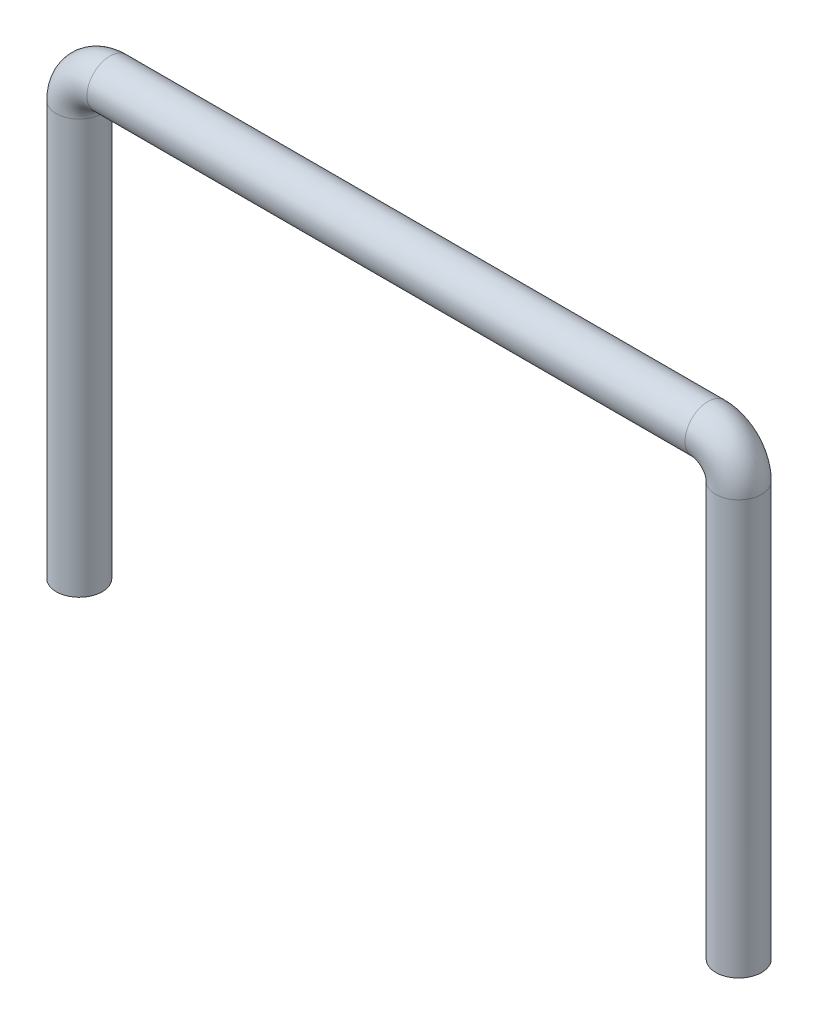
ISO-10303-21;
HEADER;
FILE_DESCRIPTION(('STEP AP214'),'2;1');
FILE_NAME('part.step','',(''),(''),'','','');
FILE_SCHEMA(('AUTOMOTIVE_DESIGN { 1 0 10303 214 1 1 1 1 }'));
ENDSEC;
DATA;
#1=APPLICATION_CONTEXT('core data for automotive mechanical design processes');
#2=APPLICATION_PROTOCOL_DEFINITION('international standard','automotive_design',2000,#1);
#3=PRODUCT_CONTEXT('',#1,'mechanical');
#4=PRODUCT('Part','Part','',(#3));
#5=PRODUCT_RELATED_PRODUCT_CATEGORY('part','',(#4));
#6=PRODUCT_DEFINITION_FORMATION('','',#4);
#7=PRODUCT_DEFINITION_CONTEXT('part definition',#1,'design');
#8=PRODUCT_DEFINITION('design','',#6,#7);
#9=PRODUCT_DEFINITION_SHAPE('','',#8);
#10=(LENGTH_UNIT() NAMED_UNIT(*) SI_UNIT(.MILLI.,.METRE.));
#11=(NAMED_UNIT(*) PLANE_ANGLE_UNIT() SI_UNIT($,.RADIAN.));
#12=(NAMED_UNIT(*) SI_UNIT($,.STERADIAN.) SOLID_ANGLE_UNIT());
#13=UNCERTAINTY_MEASURE_WITH_UNIT(LENGTH_MEASURE(1.E-05),#10,'distance_accuracy_value','');
#14=(GEOMETRIC_REPRESENTATION_CONTEXT(3) GLOBAL_UNCERTAINTY_ASSIGNED_CONTEXT((#13)) GLOBAL_UNIT_ASSIGNED_CONTEXT((#10,
#11,#12)) REPRESENTATION_CONTEXT('',''));
#15=CARTESIAN_POINT('',(0.,0.,0.));
#16=DIRECTION('',(0.,0.,1.));
#17=DIRECTION('',(1.,0.,0.));
#18=AXIS2_PLACEMENT_3D('',#15,#16,#17);
#19=CARTESIAN_POINT('',(-130.416139423431,0.,0.));
#20=DIRECTION('',(0.,1.,0.));
#21=DIRECTION('',(0.,0.,1.));
#22=AXIS2_PLACEMENT_3D('',#19,#20,#21);
#23=PLANE('',#22);
#24=CARTESIAN_POINT('',(-130.416139423431,0.,0.));
#25=DIRECTION('',(0.,1.,0.));
#26=DIRECTION('',(0.,0.,1.));
#27=AXIS2_PLACEMENT_3D('',#24,#25,#26);
#28=CIRCLE('',#27,7.50000000000001);
#29=CARTESIAN_POINT('',(-130.416139423431,0.,7.50000000000001));
#30=VERTEX_POINT('',#29);
#31=EDGE_CURVE('E61',#30,#30,#28,.T.);
#32=ORIENTED_EDGE('',*,*,#31,.F.);
#33=EDGE_LOOP('',(#32));
#34=FACE_BOUND('',#33,.T.);
#35=ADVANCED_FACE('F39',(#34),#23,.F.);
#36=CARTESIAN_POINT('',(84.5838605765687,0.,0.));
#37=DIRECTION('',(0.,-1.,0.));
#38=DIRECTION('',(0.,0.,1.));
#39=AXIS2_PLACEMENT_3D('',#36,#37,#38);
#40=PLANE('',#39);
#41=CARTESIAN_POINT('',(84.5838605765687,0.,0.));
#42=DIRECTION('',(0.,-1.,0.));
#43=DIRECTION('',(0.,0.,1.));
#44=AXIS2_PLACEMENT_3D('',#41,#42,#43);
#45=CIRCLE('',#44,7.50000000000001);
#46=CARTESIAN_POINT('',(84.5838605765687,0.,7.50000000000001));
#47=VERTEX_POINT('',#46);
#48=EDGE_CURVE('E10',#47,#47,#45,.T.);
#49=ORIENTED_EDGE('',*,*,#48,.T.);
#50=EDGE_LOOP('',(#49));
#51=FACE_BOUND('',#50,.T.);
#52=ADVANCED_FACE('F68',(#51),#40,.T.);
#53=CARTESIAN_POINT('',(-130.416139423431,0.,0.));
#54=DIRECTION('',(0.,1.,0.));
#55=DIRECTION('',(0.,0.,1.));
#56=AXIS2_PLACEMENT_3D('',#53,#54,#55);
#57=CYLINDRICAL_SURFACE('',#56,7.50000000000001);
#58=CARTESIAN_POINT('',(-130.416139423431,135.,0.));
#59=DIRECTION('',(0.,1.,0.));
#60=DIRECTION('',(0.,0.,1.));
#61=AXIS2_PLACEMENT_3D('',#58,#59,#60);
#62=CIRCLE('',#61,7.50000000000001);
#63=CARTESIAN_POINT('',(-137.916139423431,135.,0.));
#64=VERTEX_POINT('',#63);
#65=EDGE_CURVE('E58',#64,#64,#62,.T.);
#66=ORIENTED_EDGE('',*,*,#65,.F.);
#67=EDGE_LOOP('',(#66));
#68=FACE_BOUND('',#67,.T.);
#69=ORIENTED_EDGE('',*,*,#31,.T.);
#70=EDGE_LOOP('',(#69));
#71=FACE_BOUND('',#70,.T.);
#72=ADVANCED_FACE('F65',(#68,#71),#57,.T.);
#73=CARTESIAN_POINT('',(-120.416139423431,135.,0.));
#74=DIRECTION('',(0.,0.,-1.));
#75=DIRECTION('',(-1.,0.,0.));
#76=AXIS2_PLACEMENT_3D('',#73,#74,#75);
#77=TOROIDAL_SURFACE('',#76,9.99999999999999,7.50000000000001);
#78=CARTESIAN_POINT('',(-120.416139423431,145.,0.));
#79=DIRECTION('',(1.,0.,0.));
#80=DIRECTION('',(0.,0.,1.));
#81=AXIS2_PLACEMENT_3D('',#78,#79,#80);
#82=CIRCLE('',#81,7.50000000000001);
#83=CARTESIAN_POINT('',(-120.416139423431,152.5,0.));
#84=VERTEX_POINT('',#83);
#85=EDGE_CURVE('E53',#84,#84,#82,.T.);
#86=CARTESIAN_POINT('',(-120.416139423431,135.,0.));
#87=DIRECTION('',(0.,0.,-1.));
#88=DIRECTION('',(-1.,0.,0.));
#89=AXIS2_PLACEMENT_3D('',#86,#87,#88);
#90=CIRCLE('',#89,17.5);
#91=EDGE_CURVE('',#64,#84,#90,.T.);
#92=ORIENTED_EDGE('',*,*,#65,.T.);
#93=ORIENTED_EDGE('',*,*,#85,.F.);
#94=ORIENTED_EDGE('',*,*,#91,.T.);
#95=ORIENTED_EDGE('',*,*,#91,.F.);
#96=EDGE_LOOP('',(#92,#94,#93,#95));
#97=FACE_BOUND('',#96,.T.);
#98=ADVANCED_FACE('F86',(#97),#77,.T.);
#99=CARTESIAN_POINT('',(-120.416139423431,145.,0.));
#100=DIRECTION('',(1.,0.,0.));
#101=DIRECTION('',(0.,0.,-1.));
#102=AXIS2_PLACEMENT_3D('',#99,#100,#101);
#103=CYLINDRICAL_SURFACE('',#102,7.50000000000001);
#104=CARTESIAN_POINT('',(74.5838605765687,145.,0.));
#105=DIRECTION('',(1.,0.,0.));
#106=DIRECTION('',(0.,0.,1.));
#107=AXIS2_PLACEMENT_3D('',#104,#105,#106);
#108=CIRCLE('',#107,7.50000000000001);
#109=CARTESIAN_POINT('',(74.5838605765686,152.5,0.));
#110=VERTEX_POINT('',#109);
#111=EDGE_CURVE('E49',#110,#110,#108,.T.);
#112=ORIENTED_EDGE('',*,*,#111,.F.);
#113=EDGE_LOOP('',(#112));
#114=FACE_BOUND('',#113,.T.);
#115=ORIENTED_EDGE('',*,*,#85,.T.);
#116=EDGE_LOOP('',(#115));
#117=FACE_BOUND('',#116,.T.);
#118=ADVANCED_FACE('F80',(#114,#117),#103,.T.);
#119=CARTESIAN_POINT('',(74.5838605765687,135.,0.));
#120=DIRECTION('',(0.,0.,-1.));
#121=DIRECTION('',(-1.,0.,0.));
#122=AXIS2_PLACEMENT_3D('',#119,#120,#121);
#123=TOROIDAL_SURFACE('',#122,10.,7.50000000000001);
#124=CARTESIAN_POINT('',(84.5838605765687,135.,0.));
#125=DIRECTION('',(0.,-1.,0.));
#126=DIRECTION('',(0.,0.,1.));
#127=AXIS2_PLACEMENT_3D('',#124,#125,#126);
#128=CIRCLE('',#127,7.50000000000001);
#129=CARTESIAN_POINT('',(92.0838605765688,135.,0.));
#130=VERTEX_POINT('',#129);
#131=EDGE_CURVE('E45',#130,#130,#128,.T.);
#132=CARTESIAN_POINT('',(74.5838605765687,135.,0.));
#133=DIRECTION('',(0.,0.,-1.));
#134=DIRECTION('',(-1.,0.,0.));
#135=AXIS2_PLACEMENT_3D('',#132,#133,#134);
#136=CIRCLE('',#135,17.5);
#137=EDGE_CURVE('',#110,#130,#136,.T.);
#138=ORIENTED_EDGE('',*,*,#111,.T.);
#139=ORIENTED_EDGE('',*,*,#131,.F.);
#140=ORIENTED_EDGE('',*,*,#137,.T.);
#141=ORIENTED_EDGE('',*,*,#137,.F.);
#142=EDGE_LOOP('',(#138,#140,#139,#141));
#143=FACE_BOUND('',#142,.T.);
#144=ADVANCED_FACE('F74',(#143),#123,.T.);
#145=CARTESIAN_POINT('',(84.5838605765687,135.,0.));
#146=DIRECTION('',(0.,-1.,0.));
#147=DIRECTION('',(1.,0.,0.));
#148=AXIS2_PLACEMENT_3D('',#145,#146,#147);
#149=CYLINDRICAL_SURFACE('',#148,7.50000000000001);
#150=ORIENTED_EDGE('',*,*,#48,.F.);
#151=EDGE_LOOP('',(#150));
#152=FACE_BOUND('',#151,.T.);
#153=ORIENTED_EDGE('',*,*,#131,.T.);
#154=EDGE_LOOP('',(#153));
#155=FACE_BOUND('',#154,.T.);
#156=ADVANCED_FACE('F72',(#152,#155),#149,.T.);
#157=CLOSED_SHELL('',(#35,#52,#72,#98,#118,#144,#156));
#158=MANIFOLD_SOLID_BREP('B2',#157);
#159=ADVANCED_BREP_SHAPE_REPRESENTATION('',(#18,#158),#14);
#160=SHAPE_DEFINITION_REPRESENTATION(#9,#159);
ENDSEC;
END-ISO-10303-21;
